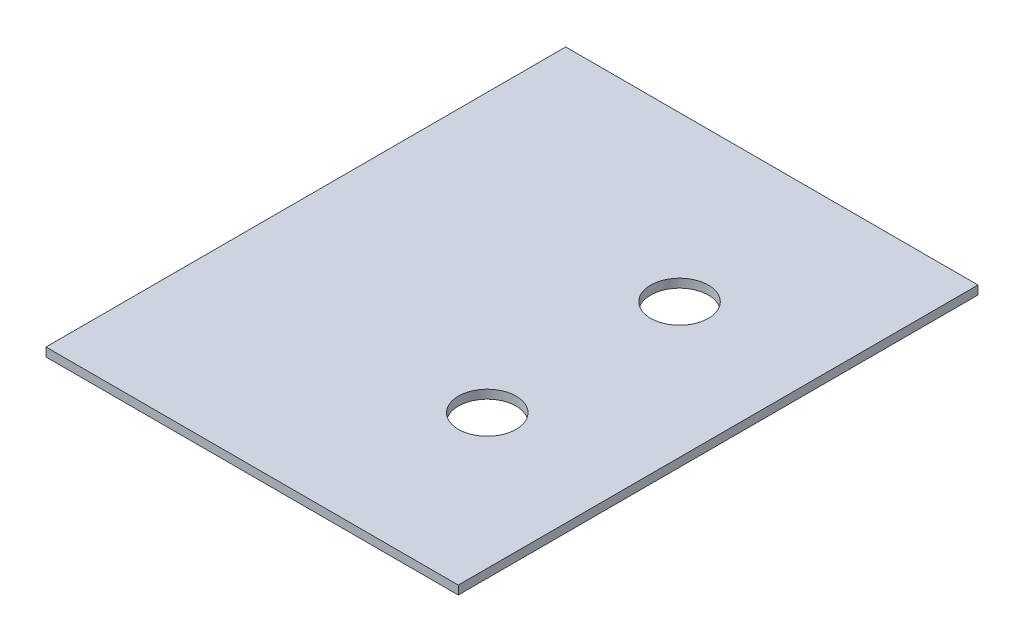
ISO-10303-21;
HEADER;
FILE_DESCRIPTION(('STEP AP214'),'2;1');
FILE_NAME('part.step','',(''),(''),'','','');
FILE_SCHEMA(('AUTOMOTIVE_DESIGN { 1 0 10303 214 1 1 1 1 }'));
ENDSEC;
DATA;
#1=APPLICATION_CONTEXT('core data for automotive mechanical design processes');
#2=APPLICATION_PROTOCOL_DEFINITION('international standard','automotive_design',2000,#1);
#3=PRODUCT_CONTEXT('',#1,'mechanical');
#4=PRODUCT('Part','Part','',(#3));
#5=PRODUCT_RELATED_PRODUCT_CATEGORY('part','',(#4));
#6=PRODUCT_DEFINITION_FORMATION('','',#4);
#7=PRODUCT_DEFINITION_CONTEXT('part definition',#1,'design');
#8=PRODUCT_DEFINITION('design','',#6,#7);
#9=PRODUCT_DEFINITION_SHAPE('','',#8);
#10=(LENGTH_UNIT() NAMED_UNIT(*) SI_UNIT(.MILLI.,.METRE.));
#11=(NAMED_UNIT(*) PLANE_ANGLE_UNIT() SI_UNIT($,.RADIAN.));
#12=(NAMED_UNIT(*) SI_UNIT($,.STERADIAN.) SOLID_ANGLE_UNIT());
#13=UNCERTAINTY_MEASURE_WITH_UNIT(LENGTH_MEASURE(1.E-05),#10,'distance_accuracy_value','');
#14=(GEOMETRIC_REPRESENTATION_CONTEXT(3) GLOBAL_UNCERTAINTY_ASSIGNED_CONTEXT((#13)) GLOBAL_UNIT_ASSIGNED_CONTEXT((#10,
#11,#12)) REPRESENTATION_CONTEXT('',''));
#15=CARTESIAN_POINT('',(0.,0.,0.));
#16=DIRECTION('',(0.,0.,1.));
#17=DIRECTION('',(1.,0.,0.));
#18=AXIS2_PLACEMENT_3D('',#15,#16,#17);
#19=CARTESIAN_POINT('',(11.9,0.5,-15.));
#20=DIRECTION('',(-1.,0.,0.));
#21=DIRECTION('',(0.,0.,1.));
#22=AXIS2_PLACEMENT_3D('',#19,#20,#21);
#23=PLANE('',#22);
#24=DIRECTION('',(0.,0.,-1.));
#25=VECTOR('',#24,1.);
#26=CARTESIAN_POINT('',(11.9,0.,-15.));
#27=LINE('',#26,#25);
#28=CARTESIAN_POINT('',(11.9,0.,15.));
#29=VERTEX_POINT('',#28);
#30=CARTESIAN_POINT('',(11.9,0.,-15.));
#31=VERTEX_POINT('',#30);
#32=EDGE_CURVE('E98',#29,#31,#27,.T.);
#33=ORIENTED_EDGE('',*,*,#32,.T.);
#34=DIRECTION('',(0.,-1.,0.));
#35=VECTOR('',#34,1.);
#36=CARTESIAN_POINT('',(11.9,0.5,-15.));
#37=LINE('',#36,#35);
#38=CARTESIAN_POINT('',(11.9,0.5,-15.));
#39=VERTEX_POINT('',#38);
#40=EDGE_CURVE('E11',#39,#31,#37,.T.);
#41=ORIENTED_EDGE('',*,*,#40,.F.);
#42=DIRECTION('',(0.,0.,-1.));
#43=VECTOR('',#42,1.);
#44=CARTESIAN_POINT('',(11.9,0.5,-15.));
#45=LINE('',#44,#43);
#46=CARTESIAN_POINT('',(11.9,0.5,15.));
#47=VERTEX_POINT('',#46);
#48=EDGE_CURVE('E86',#47,#39,#45,.T.);
#49=ORIENTED_EDGE('',*,*,#48,.F.);
#50=DIRECTION('',(0.,-1.,0.));
#51=VECTOR('',#50,1.);
#52=CARTESIAN_POINT('',(11.9,0.5,15.));
#53=LINE('',#52,#51);
#54=EDGE_CURVE('E94',#47,#29,#53,.T.);
#55=ORIENTED_EDGE('',*,*,#54,.T.);
#56=EDGE_LOOP('',(#33,#41,#49,#55));
#57=FACE_BOUND('',#56,.T.);
#58=ADVANCED_FACE('F35',(#57),#23,.F.);
#59=CARTESIAN_POINT('',(-11.9,0.5,-15.));
#60=DIRECTION('',(0.,0.,1.));
#61=DIRECTION('',(1.,0.,0.));
#62=AXIS2_PLACEMENT_3D('',#59,#60,#61);
#63=PLANE('',#62);
#64=DIRECTION('',(-1.,0.,0.));
#65=VECTOR('',#64,1.);
#66=CARTESIAN_POINT('',(-11.9,0.,-15.));
#67=LINE('',#66,#65);
#68=CARTESIAN_POINT('',(-11.9,0.,-15.));
#69=VERTEX_POINT('',#68);
#70=EDGE_CURVE('E90',#31,#69,#67,.T.);
#71=ORIENTED_EDGE('',*,*,#70,.T.);
#72=DIRECTION('',(0.,-1.,0.));
#73=VECTOR('',#72,1.);
#74=CARTESIAN_POINT('',(-11.9,0.5,-15.));
#75=LINE('',#74,#73);
#76=CARTESIAN_POINT('',(-11.9,0.5,-15.));
#77=VERTEX_POINT('',#76);
#78=EDGE_CURVE('E43',#77,#69,#75,.T.);
#79=ORIENTED_EDGE('',*,*,#78,.F.);
#80=DIRECTION('',(-1.,0.,0.));
#81=VECTOR('',#80,1.);
#82=CARTESIAN_POINT('',(-11.9,0.5,-15.));
#83=LINE('',#82,#81);
#84=EDGE_CURVE('E81',#39,#77,#83,.T.);
#85=ORIENTED_EDGE('',*,*,#84,.F.);
#86=ORIENTED_EDGE('',*,*,#40,.T.);
#87=EDGE_LOOP('',(#71,#79,#85,#86));
#88=FACE_BOUND('',#87,.T.);
#89=ADVANCED_FACE('F89',(#88),#63,.F.);
#90=CARTESIAN_POINT('',(-11.9,0.5,-15.));
#91=DIRECTION('',(1.,0.,0.));
#92=DIRECTION('',(0.,0.,-1.));
#93=AXIS2_PLACEMENT_3D('',#90,#91,#92);
#94=PLANE('',#93);
#95=DIRECTION('',(0.,0.,1.));
#96=VECTOR('',#95,1.);
#97=CARTESIAN_POINT('',(-11.9,0.,-15.));
#98=LINE('',#97,#96);
#99=CARTESIAN_POINT('',(-11.9,0.,15.));
#100=VERTEX_POINT('',#99);
#101=EDGE_CURVE('E68',#69,#100,#98,.T.);
#102=ORIENTED_EDGE('',*,*,#101,.T.);
#103=DIRECTION('',(0.,-1.,0.));
#104=VECTOR('',#103,1.);
#105=CARTESIAN_POINT('',(-11.9,0.5,15.));
#106=LINE('',#105,#104);
#107=CARTESIAN_POINT('',(-11.9,0.5,15.));
#108=VERTEX_POINT('',#107);
#109=EDGE_CURVE('E91',#108,#100,#106,.T.);
#110=ORIENTED_EDGE('',*,*,#109,.F.);
#111=DIRECTION('',(0.,0.,1.));
#112=VECTOR('',#111,1.);
#113=CARTESIAN_POINT('',(-11.9,0.5,-15.));
#114=LINE('',#113,#112);
#115=EDGE_CURVE('E84',#77,#108,#114,.T.);
#116=ORIENTED_EDGE('',*,*,#115,.F.);
#117=ORIENTED_EDGE('',*,*,#78,.T.);
#118=EDGE_LOOP('',(#102,#110,#116,#117));
#119=FACE_BOUND('',#118,.T.);
#120=ADVANCED_FACE('F92',(#119),#94,.F.);
#121=CARTESIAN_POINT('',(-11.9,0.5,15.));
#122=DIRECTION('',(0.,0.,-1.));
#123=DIRECTION('',(-1.,0.,0.));
#124=AXIS2_PLACEMENT_3D('',#121,#122,#123);
#125=PLANE('',#124);
#126=DIRECTION('',(1.,0.,0.));
#127=VECTOR('',#126,1.);
#128=CARTESIAN_POINT('',(-11.9,0.,15.));
#129=LINE('',#128,#127);
#130=EDGE_CURVE('E74',#100,#29,#129,.T.);
#131=ORIENTED_EDGE('',*,*,#130,.T.);
#132=ORIENTED_EDGE('',*,*,#54,.F.);
#133=DIRECTION('',(1.,0.,0.));
#134=VECTOR('',#133,1.);
#135=CARTESIAN_POINT('',(-11.9,0.5,15.));
#136=LINE('',#135,#134);
#137=EDGE_CURVE('E51',#108,#47,#136,.T.);
#138=ORIENTED_EDGE('',*,*,#137,.F.);
#139=ORIENTED_EDGE('',*,*,#109,.T.);
#140=EDGE_LOOP('',(#131,#132,#138,#139));
#141=FACE_BOUND('',#140,.T.);
#142=ADVANCED_FACE('F106',(#141),#125,.F.);
#143=CARTESIAN_POINT('',(0.,0.5,0.));
#144=DIRECTION('',(0.,1.,0.));
#145=DIRECTION('',(0.,0.,1.));
#146=AXIS2_PLACEMENT_3D('',#143,#144,#145);
#147=PLANE('',#146);
#148=CARTESIAN_POINT('',(4.12138086569771,0.5,-5.54938636770919));
#149=DIRECTION('',(0.,1.,0.));
#150=DIRECTION('',(0.,0.,1.));
#151=AXIS2_PLACEMENT_3D('',#148,#149,#150);
#152=CIRCLE('',#151,1.665);
#153=CARTESIAN_POINT('',(4.12138086569771,0.5,-3.88438636770919));
#154=VERTEX_POINT('',#153);
#155=EDGE_CURVE('E115',#154,#154,#152,.T.);
#156=ORIENTED_EDGE('',*,*,#155,.F.);
#157=EDGE_LOOP('',(#156));
#158=FACE_BOUND('',#157,.T.);
#159=CARTESIAN_POINT('',(4.12138086569771,0.5,5.55000000000002));
#160=DIRECTION('',(0.,1.,0.));
#161=DIRECTION('',(0.,0.,1.));
#162=AXIS2_PLACEMENT_3D('',#159,#160,#161);
#163=CIRCLE('',#162,1.665);
#164=CARTESIAN_POINT('',(4.12138086569771,0.5,7.21500000000002));
#165=VERTEX_POINT('',#164);
#166=EDGE_CURVE('E116',#165,#165,#163,.T.);
#167=ORIENTED_EDGE('',*,*,#166,.F.);
#168=EDGE_LOOP('',(#167));
#169=FACE_BOUND('',#168,.T.);
#170=ORIENTED_EDGE('',*,*,#48,.T.);
#171=ORIENTED_EDGE('',*,*,#84,.T.);
#172=ORIENTED_EDGE('',*,*,#115,.T.);
#173=ORIENTED_EDGE('',*,*,#137,.T.);
#174=EDGE_LOOP('',(#170,#171,#172,#173));
#175=FACE_BOUND('',#174,.T.);
#176=ADVANCED_FACE('F82',(#158,#169,#175),#147,.T.);
#177=CARTESIAN_POINT('',(0.,0.,0.));
#178=DIRECTION('',(0.,1.,0.));
#179=DIRECTION('',(0.,0.,1.));
#180=AXIS2_PLACEMENT_3D('',#177,#178,#179);
#181=PLANE('',#180);
#182=CARTESIAN_POINT('',(4.12138086569771,0.,-5.54938636770919));
#183=DIRECTION('',(0.,1.,0.));
#184=DIRECTION('',(0.,0.,1.));
#185=AXIS2_PLACEMENT_3D('',#182,#183,#184);
#186=CIRCLE('',#185,1.665);
#187=CARTESIAN_POINT('',(4.12138086569771,0.,-3.88438636770919));
#188=VERTEX_POINT('',#187);
#189=EDGE_CURVE('E101',#188,#188,#186,.F.);
#190=ORIENTED_EDGE('',*,*,#189,.F.);
#191=EDGE_LOOP('',(#190));
#192=FACE_BOUND('',#191,.T.);
#193=CARTESIAN_POINT('',(4.12138086569771,0.,5.55000000000002));
#194=DIRECTION('',(0.,1.,0.));
#195=DIRECTION('',(0.,0.,1.));
#196=AXIS2_PLACEMENT_3D('',#193,#194,#195);
#197=CIRCLE('',#196,1.665);
#198=CARTESIAN_POINT('',(4.12138086569771,0.,7.21500000000002));
#199=VERTEX_POINT('',#198);
#200=EDGE_CURVE('E112',#199,#199,#197,.F.);
#201=ORIENTED_EDGE('',*,*,#200,.F.);
#202=EDGE_LOOP('',(#201));
#203=FACE_BOUND('',#202,.T.);
#204=ORIENTED_EDGE('',*,*,#32,.F.);
#205=ORIENTED_EDGE('',*,*,#130,.F.);
#206=ORIENTED_EDGE('',*,*,#101,.F.);
#207=ORIENTED_EDGE('',*,*,#70,.F.);
#208=EDGE_LOOP('',(#204,#205,#206,#207));
#209=FACE_BOUND('',#208,.T.);
#210=ADVANCED_FACE('F109',(#192,#203,#209),#181,.F.);
#211=CARTESIAN_POINT('',(4.12138086569771,-0.00100000000000002,5.55000000000002));
#212=DIRECTION('',(0.,1.,0.));
#213=DIRECTION('',(0.,0.,1.));
#214=AXIS2_PLACEMENT_3D('',#211,#212,#213);
#215=CYLINDRICAL_SURFACE('',#214,1.665);
#216=ORIENTED_EDGE('',*,*,#166,.T.);
#217=EDGE_LOOP('',(#216));
#218=FACE_BOUND('',#217,.T.);
#219=ORIENTED_EDGE('',*,*,#200,.T.);
#220=EDGE_LOOP('',(#219));
#221=FACE_BOUND('',#220,.T.);
#222=ADVANCED_FACE('F132',(#218,#221),#215,.F.);
#223=CARTESIAN_POINT('',(4.12138086569771,-0.00100000000000002,-5.54938636770919));
#224=DIRECTION('',(0.,1.,0.));
#225=DIRECTION('',(0.,0.,1.));
#226=AXIS2_PLACEMENT_3D('',#223,#224,#225);
#227=CYLINDRICAL_SURFACE('',#226,1.665);
#228=ORIENTED_EDGE('',*,*,#155,.T.);
#229=EDGE_LOOP('',(#228));
#230=FACE_BOUND('',#229,.T.);
#231=ORIENTED_EDGE('',*,*,#189,.T.);
#232=EDGE_LOOP('',(#231));
#233=FACE_BOUND('',#232,.T.);
#234=ADVANCED_FACE('F124',(#230,#233),#227,.F.);
#235=CLOSED_SHELL('',(#58,#89,#120,#142,#176,#210,#222,#234));
#236=MANIFOLD_SOLID_BREP('B2',#235);
#237=ADVANCED_BREP_SHAPE_REPRESENTATION('',(#18,#236),#14);
#238=SHAPE_DEFINITION_REPRESENTATION(#9,#237);
ENDSEC;
END-ISO-10303-21;
